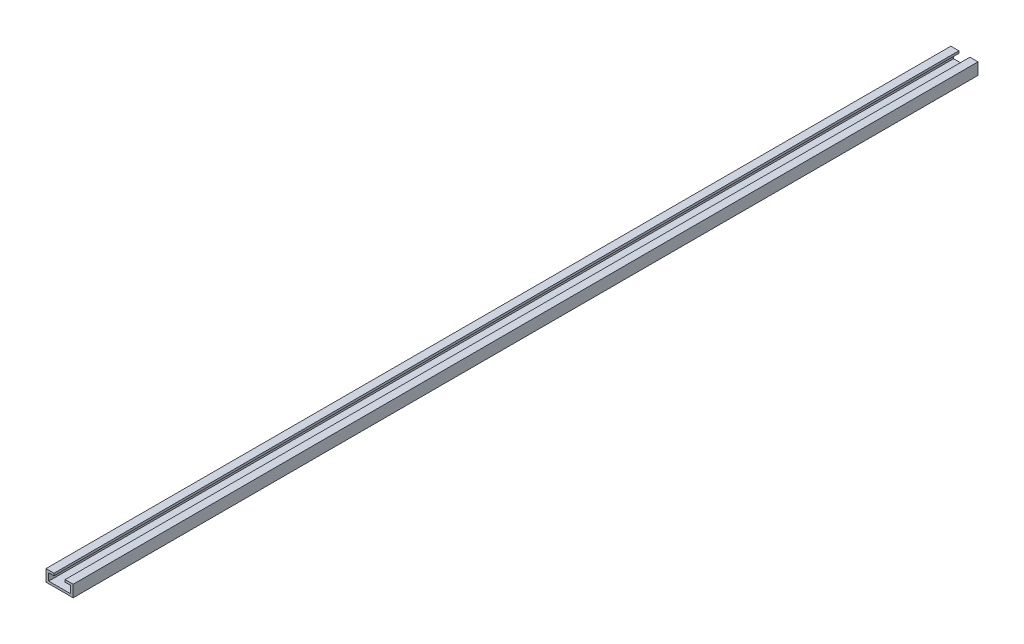
ISO-10303-21;
HEADER;
FILE_DESCRIPTION(('STEP AP214'),'2;1');
FILE_NAME('part.step','',(''),(''),'','','');
FILE_SCHEMA(('AUTOMOTIVE_DESIGN { 1 0 10303 214 1 1 1 1 }'));
ENDSEC;
DATA;
#1=APPLICATION_CONTEXT('core data for automotive mechanical design processes');
#2=APPLICATION_PROTOCOL_DEFINITION('international standard','automotive_design',2000,#1);
#3=PRODUCT_CONTEXT('',#1,'mechanical');
#4=PRODUCT('Part','Part','',(#3));
#5=PRODUCT_RELATED_PRODUCT_CATEGORY('part','',(#4));
#6=PRODUCT_DEFINITION_FORMATION('','',#4);
#7=PRODUCT_DEFINITION_CONTEXT('part definition',#1,'design');
#8=PRODUCT_DEFINITION('design','',#6,#7);
#9=PRODUCT_DEFINITION_SHAPE('','',#8);
#10=(LENGTH_UNIT() NAMED_UNIT(*) SI_UNIT(.MILLI.,.METRE.));
#11=(NAMED_UNIT(*) PLANE_ANGLE_UNIT() SI_UNIT($,.RADIAN.));
#12=(NAMED_UNIT(*) SI_UNIT($,.STERADIAN.) SOLID_ANGLE_UNIT());
#13=UNCERTAINTY_MEASURE_WITH_UNIT(LENGTH_MEASURE(1.E-05),#10,'distance_accuracy_value','');
#14=(GEOMETRIC_REPRESENTATION_CONTEXT(3) GLOBAL_UNCERTAINTY_ASSIGNED_CONTEXT((#13)) GLOBAL_UNIT_ASSIGNED_CONTEXT((#10,
#11,#12)) REPRESENTATION_CONTEXT('',''));
#15=CARTESIAN_POINT('',(0.,0.,0.));
#16=DIRECTION('',(0.,0.,1.));
#17=DIRECTION('',(1.,0.,0.));
#18=AXIS2_PLACEMENT_3D('',#15,#16,#17);
#19=CARTESIAN_POINT('',(15.,13.0282977305688,1000.));
#20=DIRECTION('',(-1.,0.,0.));
#21=DIRECTION('',(0.,0.,1.));
#22=AXIS2_PLACEMENT_3D('',#19,#20,#21);
#23=PLANE('',#22);
#24=DIRECTION('',(0.,1.,0.));
#25=VECTOR('',#24,1.);
#26=CARTESIAN_POINT('',(15.,13.0282977305688,0.));
#27=LINE('',#26,#25);
#28=CARTESIAN_POINT('',(15.,0.,0.));
#29=VERTEX_POINT('',#28);
#30=CARTESIAN_POINT('',(15.,13.0282977305688,0.));
#31=VERTEX_POINT('',#30);
#32=EDGE_CURVE('E154',#29,#31,#27,.T.);
#33=ORIENTED_EDGE('',*,*,#32,.T.);
#34=DIRECTION('',(0.,0.,-1.));
#35=VECTOR('',#34,1.);
#36=CARTESIAN_POINT('',(15.,13.0282977305688,1000.));
#37=LINE('',#36,#35);
#38=CARTESIAN_POINT('',(15.,13.0282977305688,1000.));
#39=VERTEX_POINT('',#38);
#40=EDGE_CURVE('E11',#39,#31,#37,.T.);
#41=ORIENTED_EDGE('',*,*,#40,.F.);
#42=DIRECTION('',(0.,1.,0.));
#43=VECTOR('',#42,1.);
#44=CARTESIAN_POINT('',(15.,13.0282977305688,1000.));
#45=LINE('',#44,#43);
#46=CARTESIAN_POINT('',(15.,0.,1000.));
#47=VERTEX_POINT('',#46);
#48=EDGE_CURVE('E177',#47,#39,#45,.T.);
#49=ORIENTED_EDGE('',*,*,#48,.F.);
#50=DIRECTION('',(0.,0.,-1.));
#51=VECTOR('',#50,1.);
#52=CARTESIAN_POINT('',(15.,0.,1000.));
#53=LINE('',#52,#51);
#54=EDGE_CURVE('E150',#47,#29,#53,.T.);
#55=ORIENTED_EDGE('',*,*,#54,.T.);
#56=EDGE_LOOP('',(#33,#41,#49,#55));
#57=FACE_BOUND('',#56,.T.);
#58=ADVANCED_FACE('F35',(#57),#23,.F.);
#59=CARTESIAN_POINT('',(6.1,13.0282977305688,1000.));
#60=DIRECTION('',(0.,-1.,0.));
#61=DIRECTION('',(0.,0.,-1.));
#62=AXIS2_PLACEMENT_3D('',#59,#60,#61);
#63=PLANE('',#62);
#64=DIRECTION('',(-1.,0.,0.));
#65=VECTOR('',#64,1.);
#66=CARTESIAN_POINT('',(6.1,13.0282977305688,0.));
#67=LINE('',#66,#65);
#68=CARTESIAN_POINT('',(6.1,13.0282977305688,0.));
#69=VERTEX_POINT('',#68);
#70=EDGE_CURVE('E157',#31,#69,#67,.T.);
#71=ORIENTED_EDGE('',*,*,#70,.T.);
#72=DIRECTION('',(0.,0.,-1.));
#73=VECTOR('',#72,1.);
#74=CARTESIAN_POINT('',(6.1,13.0282977305688,1000.));
#75=LINE('',#74,#73);
#76=CARTESIAN_POINT('',(6.1,13.0282977305688,1000.));
#77=VERTEX_POINT('',#76);
#78=EDGE_CURVE('E43',#77,#69,#75,.T.);
#79=ORIENTED_EDGE('',*,*,#78,.F.);
#80=DIRECTION('',(-1.,0.,0.));
#81=VECTOR('',#80,1.);
#82=CARTESIAN_POINT('',(12.,13.0282977305688,1000.));
#83=LINE('',#82,#81);
#84=EDGE_CURVE('E106',#39,#77,#83,.T.);
#85=ORIENTED_EDGE('',*,*,#84,.F.);
#86=ORIENTED_EDGE('',*,*,#40,.T.);
#87=EDGE_LOOP('',(#71,#79,#85,#86));
#88=FACE_BOUND('',#87,.T.);
#89=ADVANCED_FACE('F256',(#88),#63,.F.);
#90=CARTESIAN_POINT('',(6.1,10.5282977305688,1000.));
#91=DIRECTION('',(1.,0.,0.));
#92=DIRECTION('',(0.,0.,-1.));
#93=AXIS2_PLACEMENT_3D('',#90,#91,#92);
#94=PLANE('',#93);
#95=DIRECTION('',(0.,-1.,0.));
#96=VECTOR('',#95,1.);
#97=CARTESIAN_POINT('',(6.1,10.5282977305688,0.));
#98=LINE('',#97,#96);
#99=CARTESIAN_POINT('',(6.1,10.5282977305688,0.));
#100=VERTEX_POINT('',#99);
#101=EDGE_CURVE('E159',#69,#100,#98,.T.);
#102=ORIENTED_EDGE('',*,*,#101,.T.);
#103=DIRECTION('',(0.,0.,-1.));
#104=VECTOR('',#103,1.);
#105=CARTESIAN_POINT('',(6.1,10.5282977305688,1000.));
#106=LINE('',#105,#104);
#107=CARTESIAN_POINT('',(6.1,10.5282977305688,1000.));
#108=VERTEX_POINT('',#107);
#109=EDGE_CURVE('E196',#108,#100,#106,.T.);
#110=ORIENTED_EDGE('',*,*,#109,.F.);
#111=DIRECTION('',(0.,-1.,0.));
#112=VECTOR('',#111,1.);
#113=CARTESIAN_POINT('',(6.1,10.5282977305688,1000.));
#114=LINE('',#113,#112);
#115=EDGE_CURVE('E204',#77,#108,#114,.T.);
#116=ORIENTED_EDGE('',*,*,#115,.F.);
#117=ORIENTED_EDGE('',*,*,#78,.T.);
#118=EDGE_LOOP('',(#102,#110,#116,#117));
#119=FACE_BOUND('',#118,.T.);
#120=ADVANCED_FACE('F202',(#119),#94,.F.);
#121=CARTESIAN_POINT('',(12.,10.5282977305688,1000.));
#122=DIRECTION('',(0.,1.,0.));
#123=DIRECTION('',(0.,0.,1.));
#124=AXIS2_PLACEMENT_3D('',#121,#122,#123);
#125=PLANE('',#124);
#126=DIRECTION('',(1.,0.,0.));
#127=VECTOR('',#126,1.);
#128=CARTESIAN_POINT('',(12.,10.5282977305688,0.));
#129=LINE('',#128,#127);
#130=CARTESIAN_POINT('',(12.,10.5282977305688,0.));
#131=VERTEX_POINT('',#130);
#132=EDGE_CURVE('E161',#100,#131,#129,.T.);
#133=ORIENTED_EDGE('',*,*,#132,.T.);
#134=DIRECTION('',(0.,0.,-1.));
#135=VECTOR('',#134,1.);
#136=CARTESIAN_POINT('',(12.,10.5282977305688,1000.));
#137=LINE('',#136,#135);
#138=CARTESIAN_POINT('',(12.,10.5282977305688,1000.));
#139=VERTEX_POINT('',#138);
#140=EDGE_CURVE('E193',#139,#131,#137,.T.);
#141=ORIENTED_EDGE('',*,*,#140,.F.);
#142=DIRECTION('',(1.,0.,0.));
#143=VECTOR('',#142,1.);
#144=CARTESIAN_POINT('',(12.,10.5282977305688,1000.));
#145=LINE('',#144,#143);
#146=EDGE_CURVE('E222',#108,#139,#145,.T.);
#147=ORIENTED_EDGE('',*,*,#146,.F.);
#148=ORIENTED_EDGE('',*,*,#109,.T.);
#149=EDGE_LOOP('',(#133,#141,#147,#148));
#150=FACE_BOUND('',#149,.T.);
#151=ADVANCED_FACE('F213',(#150),#125,.F.);
#152=CARTESIAN_POINT('',(12.,2.5,1000.));
#153=DIRECTION('',(1.,0.,0.));
#154=DIRECTION('',(0.,0.,-1.));
#155=AXIS2_PLACEMENT_3D('',#152,#153,#154);
#156=PLANE('',#155);
#157=DIRECTION('',(0.,-1.,0.));
#158=VECTOR('',#157,1.);
#159=CARTESIAN_POINT('',(12.,2.5,0.));
#160=LINE('',#159,#158);
#161=CARTESIAN_POINT('',(12.,2.5,0.));
#162=VERTEX_POINT('',#161);
#163=EDGE_CURVE('E163',#131,#162,#160,.T.);
#164=ORIENTED_EDGE('',*,*,#163,.T.);
#165=DIRECTION('',(0.,0.,-1.));
#166=VECTOR('',#165,1.);
#167=CARTESIAN_POINT('',(12.,2.5,1000.));
#168=LINE('',#167,#166);
#169=CARTESIAN_POINT('',(12.,2.5,1000.));
#170=VERTEX_POINT('',#169);
#171=EDGE_CURVE('E190',#170,#162,#168,.T.);
#172=ORIENTED_EDGE('',*,*,#171,.F.);
#173=DIRECTION('',(0.,-1.,0.));
#174=VECTOR('',#173,1.);
#175=CARTESIAN_POINT('',(12.,2.5,1000.));
#176=LINE('',#175,#174);
#177=EDGE_CURVE('E219',#139,#170,#176,.T.);
#178=ORIENTED_EDGE('',*,*,#177,.F.);
#179=ORIENTED_EDGE('',*,*,#140,.T.);
#180=EDGE_LOOP('',(#164,#172,#178,#179));
#181=FACE_BOUND('',#180,.T.);
#182=ADVANCED_FACE('F217',(#181),#156,.F.);
#183=CARTESIAN_POINT('',(-12.,2.50000000000001,1000.));
#184=DIRECTION('',(0.,-1.,0.));
#185=DIRECTION('',(1.,0.,0.));
#186=AXIS2_PLACEMENT_3D('',#183,#184,#185);
#187=PLANE('',#186);
#188=DIRECTION('',(-1.,0.,0.));
#189=VECTOR('',#188,1.);
#190=CARTESIAN_POINT('',(-12.,2.50000000000001,0.));
#191=LINE('',#190,#189);
#192=CARTESIAN_POINT('',(-12.,2.50000000000001,0.));
#193=VERTEX_POINT('',#192);
#194=EDGE_CURVE('E165',#162,#193,#191,.T.);
#195=ORIENTED_EDGE('',*,*,#194,.T.);
#196=DIRECTION('',(0.,0.,-1.));
#197=VECTOR('',#196,1.);
#198=CARTESIAN_POINT('',(-12.,2.50000000000001,1000.));
#199=LINE('',#198,#197);
#200=CARTESIAN_POINT('',(-12.,2.50000000000001,1000.));
#201=VERTEX_POINT('',#200);
#202=EDGE_CURVE('E187',#201,#193,#199,.T.);
#203=ORIENTED_EDGE('',*,*,#202,.F.);
#204=DIRECTION('',(-1.,0.,0.));
#205=VECTOR('',#204,1.);
#206=CARTESIAN_POINT('',(-12.,2.50000000000001,1000.));
#207=LINE('',#206,#205);
#208=EDGE_CURVE('E221',#170,#201,#207,.T.);
#209=ORIENTED_EDGE('',*,*,#208,.F.);
#210=ORIENTED_EDGE('',*,*,#171,.T.);
#211=EDGE_LOOP('',(#195,#203,#209,#210));
#212=FACE_BOUND('',#211,.T.);
#213=ADVANCED_FACE('F269',(#212),#187,.F.);
#214=CARTESIAN_POINT('',(-12.,2.50000000000001,1000.));
#215=DIRECTION('',(-1.,0.,0.));
#216=DIRECTION('',(0.,-1.,0.));
#217=AXIS2_PLACEMENT_3D('',#214,#215,#216);
#218=PLANE('',#217);
#219=DIRECTION('',(0.,1.,0.));
#220=VECTOR('',#219,1.);
#221=CARTESIAN_POINT('',(-12.,2.50000000000001,0.));
#222=LINE('',#221,#220);
#223=CARTESIAN_POINT('',(-12.,10.5282977305688,0.));
#224=VERTEX_POINT('',#223);
#225=EDGE_CURVE('E167',#193,#224,#222,.T.);
#226=ORIENTED_EDGE('',*,*,#225,.T.);
#227=DIRECTION('',(0.,0.,-1.));
#228=VECTOR('',#227,1.);
#229=CARTESIAN_POINT('',(-12.,10.5282977305688,1000.));
#230=LINE('',#229,#228);
#231=CARTESIAN_POINT('',(-12.,10.5282977305688,1000.));
#232=VERTEX_POINT('',#231);
#233=EDGE_CURVE('E184',#232,#224,#230,.T.);
#234=ORIENTED_EDGE('',*,*,#233,.F.);
#235=DIRECTION('',(0.,1.,0.));
#236=VECTOR('',#235,1.);
#237=CARTESIAN_POINT('',(-12.,2.50000000000001,1000.));
#238=LINE('',#237,#236);
#239=EDGE_CURVE('E224',#201,#232,#238,.T.);
#240=ORIENTED_EDGE('',*,*,#239,.F.);
#241=ORIENTED_EDGE('',*,*,#202,.T.);
#242=EDGE_LOOP('',(#226,#234,#240,#241));
#243=FACE_BOUND('',#242,.T.);
#244=ADVANCED_FACE('F272',(#243),#218,.F.);
#245=CARTESIAN_POINT('',(-12.,10.5282977305688,1000.));
#246=DIRECTION('',(0.,1.,0.));
#247=DIRECTION('',(-1.,0.,0.));
#248=AXIS2_PLACEMENT_3D('',#245,#246,#247);
#249=PLANE('',#248);
#250=DIRECTION('',(1.,0.,0.));
#251=VECTOR('',#250,1.);
#252=CARTESIAN_POINT('',(-12.,10.5282977305688,0.));
#253=LINE('',#252,#251);
#254=CARTESIAN_POINT('',(-6.09999999999999,10.5282977305688,0.));
#255=VERTEX_POINT('',#254);
#256=EDGE_CURVE('E169',#224,#255,#253,.T.);
#257=ORIENTED_EDGE('',*,*,#256,.T.);
#258=DIRECTION('',(0.,0.,-1.));
#259=VECTOR('',#258,1.);
#260=CARTESIAN_POINT('',(-6.09999999999999,10.5282977305688,1000.));
#261=LINE('',#260,#259);
#262=CARTESIAN_POINT('',(-6.09999999999999,10.5282977305688,1000.));
#263=VERTEX_POINT('',#262);
#264=EDGE_CURVE('E181',#263,#255,#261,.T.);
#265=ORIENTED_EDGE('',*,*,#264,.F.);
#266=DIRECTION('',(1.,0.,0.));
#267=VECTOR('',#266,1.);
#268=CARTESIAN_POINT('',(-12.,10.5282977305688,1000.));
#269=LINE('',#268,#267);
#270=EDGE_CURVE('E230',#232,#263,#269,.T.);
#271=ORIENTED_EDGE('',*,*,#270,.F.);
#272=ORIENTED_EDGE('',*,*,#233,.T.);
#273=EDGE_LOOP('',(#257,#265,#271,#272));
#274=FACE_BOUND('',#273,.T.);
#275=ADVANCED_FACE('F236',(#274),#249,.F.);
#276=CARTESIAN_POINT('',(-6.09999999999999,10.5282977305688,1000.));
#277=DIRECTION('',(-1.,0.,0.));
#278=DIRECTION('',(0.,-1.,0.));
#279=AXIS2_PLACEMENT_3D('',#276,#277,#278);
#280=PLANE('',#279);
#281=DIRECTION('',(0.,1.,0.));
#282=VECTOR('',#281,1.);
#283=CARTESIAN_POINT('',(-6.09999999999999,10.5282977305688,0.));
#284=LINE('',#283,#282);
#285=CARTESIAN_POINT('',(-6.09999999999999,13.0282977305688,0.));
#286=VERTEX_POINT('',#285);
#287=EDGE_CURVE('E171',#255,#286,#284,.T.);
#288=ORIENTED_EDGE('',*,*,#287,.T.);
#289=DIRECTION('',(0.,0.,-1.));
#290=VECTOR('',#289,1.);
#291=CARTESIAN_POINT('',(-6.09999999999999,13.0282977305688,1000.));
#292=LINE('',#291,#290);
#293=CARTESIAN_POINT('',(-6.09999999999999,13.0282977305688,1000.));
#294=VERTEX_POINT('',#293);
#295=EDGE_CURVE('E145',#294,#286,#292,.T.);
#296=ORIENTED_EDGE('',*,*,#295,.F.);
#297=DIRECTION('',(0.,1.,0.));
#298=VECTOR('',#297,1.);
#299=CARTESIAN_POINT('',(-6.09999999999999,10.5282977305688,1000.));
#300=LINE('',#299,#298);
#301=EDGE_CURVE('E137',#263,#294,#300,.T.);
#302=ORIENTED_EDGE('',*,*,#301,.F.);
#303=ORIENTED_EDGE('',*,*,#264,.T.);
#304=EDGE_LOOP('',(#288,#296,#302,#303));
#305=FACE_BOUND('',#304,.T.);
#306=ADVANCED_FACE('F240',(#305),#280,.F.);
#307=CARTESIAN_POINT('',(-12.,13.0282977305688,1000.));
#308=DIRECTION('',(0.,-1.,0.));
#309=DIRECTION('',(1.,0.,0.));
#310=AXIS2_PLACEMENT_3D('',#307,#308,#309);
#311=PLANE('',#310);
#312=DIRECTION('',(-1.,0.,0.));
#313=VECTOR('',#312,1.);
#314=CARTESIAN_POINT('',(-12.,13.0282977305688,0.));
#315=LINE('',#314,#313);
#316=CARTESIAN_POINT('',(-15.,13.0282977305688,0.));
#317=VERTEX_POINT('',#316);
#318=EDGE_CURVE('E144',#286,#317,#315,.T.);
#319=ORIENTED_EDGE('',*,*,#318,.T.);
#320=DIRECTION('',(0.,0.,-1.));
#321=VECTOR('',#320,1.);
#322=CARTESIAN_POINT('',(-15.,13.0282977305688,1000.));
#323=LINE('',#322,#321);
#324=CARTESIAN_POINT('',(-15.,13.0282977305688,1000.));
#325=VERTEX_POINT('',#324);
#326=EDGE_CURVE('E142',#325,#317,#323,.T.);
#327=ORIENTED_EDGE('',*,*,#326,.F.);
#328=DIRECTION('',(-1.,0.,0.));
#329=VECTOR('',#328,1.);
#330=CARTESIAN_POINT('',(-6.09999999999999,13.0282977305688,1000.));
#331=LINE('',#330,#329);
#332=EDGE_CURVE('E131',#294,#325,#331,.T.);
#333=ORIENTED_EDGE('',*,*,#332,.F.);
#334=ORIENTED_EDGE('',*,*,#295,.T.);
#335=EDGE_LOOP('',(#319,#327,#333,#334));
#336=FACE_BOUND('',#335,.T.);
#337=ADVANCED_FACE('F143',(#336),#311,.F.);
#338=CARTESIAN_POINT('',(-15.,13.0282977305688,1000.));
#339=DIRECTION('',(1.,0.,0.));
#340=DIRECTION('',(0.,1.,0.));
#341=AXIS2_PLACEMENT_3D('',#338,#339,#340);
#342=PLANE('',#341);
#343=DIRECTION('',(0.,-1.,0.));
#344=VECTOR('',#343,1.);
#345=CARTESIAN_POINT('',(-15.,13.0282977305688,0.));
#346=LINE('',#345,#344);
#347=CARTESIAN_POINT('',(-15.,0.,0.));
#348=VERTEX_POINT('',#347);
#349=EDGE_CURVE('E92',#317,#348,#346,.T.);
#350=ORIENTED_EDGE('',*,*,#349,.T.);
#351=DIRECTION('',(0.,0.,-1.));
#352=VECTOR('',#351,1.);
#353=CARTESIAN_POINT('',(-15.,0.,1000.));
#354=LINE('',#353,#352);
#355=CARTESIAN_POINT('',(-15.,0.,1000.));
#356=VERTEX_POINT('',#355);
#357=EDGE_CURVE('E146',#356,#348,#354,.T.);
#358=ORIENTED_EDGE('',*,*,#357,.F.);
#359=DIRECTION('',(0.,-1.,0.));
#360=VECTOR('',#359,1.);
#361=CARTESIAN_POINT('',(-15.,13.0282977305688,1000.));
#362=LINE('',#361,#360);
#363=EDGE_CURVE('E135',#325,#356,#362,.T.);
#364=ORIENTED_EDGE('',*,*,#363,.F.);
#365=ORIENTED_EDGE('',*,*,#326,.T.);
#366=EDGE_LOOP('',(#350,#358,#364,#365));
#367=FACE_BOUND('',#366,.T.);
#368=ADVANCED_FACE('F148',(#367),#342,.F.);
#369=CARTESIAN_POINT('',(-15.,0.,1000.));
#370=DIRECTION('',(0.,1.,0.));
#371=DIRECTION('',(-1.,0.,0.));
#372=AXIS2_PLACEMENT_3D('',#369,#370,#371);
#373=PLANE('',#372);
#374=DIRECTION('',(1.,0.,0.));
#375=VECTOR('',#374,1.);
#376=CARTESIAN_POINT('',(-15.,0.,0.));
#377=LINE('',#376,#375);
#378=EDGE_CURVE('E98',#348,#29,#377,.T.);
#379=ORIENTED_EDGE('',*,*,#378,.T.);
#380=ORIENTED_EDGE('',*,*,#54,.F.);
#381=DIRECTION('',(1.,0.,0.));
#382=VECTOR('',#381,1.);
#383=CARTESIAN_POINT('',(-15.,0.,1000.));
#384=LINE('',#383,#382);
#385=EDGE_CURVE('E51',#356,#47,#384,.T.);
#386=ORIENTED_EDGE('',*,*,#385,.F.);
#387=ORIENTED_EDGE('',*,*,#357,.T.);
#388=EDGE_LOOP('',(#379,#380,#386,#387));
#389=FACE_BOUND('',#388,.T.);
#390=ADVANCED_FACE('F245',(#389),#373,.F.);
#391=CARTESIAN_POINT('',(0.,0.,1000.));
#392=DIRECTION('',(0.,0.,1.));
#393=DIRECTION('',(1.,0.,0.));
#394=AXIS2_PLACEMENT_3D('',#391,#392,#393);
#395=PLANE('',#394);
#396=ORIENTED_EDGE('',*,*,#48,.T.);
#397=ORIENTED_EDGE('',*,*,#84,.T.);
#398=ORIENTED_EDGE('',*,*,#115,.T.);
#399=ORIENTED_EDGE('',*,*,#146,.T.);
#400=ORIENTED_EDGE('',*,*,#177,.T.);
#401=ORIENTED_EDGE('',*,*,#208,.T.);
#402=ORIENTED_EDGE('',*,*,#239,.T.);
#403=ORIENTED_EDGE('',*,*,#270,.T.);
#404=ORIENTED_EDGE('',*,*,#301,.T.);
#405=ORIENTED_EDGE('',*,*,#332,.T.);
#406=ORIENTED_EDGE('',*,*,#363,.T.);
#407=ORIENTED_EDGE('',*,*,#385,.T.);
#408=EDGE_LOOP('',(#396,#397,#398,#399,#400,#401,#402,#403,#404,#405,#406,#407));
#409=FACE_BOUND('',#408,.T.);
#410=ADVANCED_FACE('F133',(#409),#395,.T.);
#411=CARTESIAN_POINT('',(0.,0.,0.));
#412=DIRECTION('',(0.,0.,1.));
#413=DIRECTION('',(1.,0.,0.));
#414=AXIS2_PLACEMENT_3D('',#411,#412,#413);
#415=PLANE('',#414);
#416=ORIENTED_EDGE('',*,*,#32,.F.);
#417=ORIENTED_EDGE('',*,*,#378,.F.);
#418=ORIENTED_EDGE('',*,*,#349,.F.);
#419=ORIENTED_EDGE('',*,*,#318,.F.);
#420=ORIENTED_EDGE('',*,*,#287,.F.);
#421=ORIENTED_EDGE('',*,*,#256,.F.);
#422=ORIENTED_EDGE('',*,*,#225,.F.);
#423=ORIENTED_EDGE('',*,*,#194,.F.);
#424=ORIENTED_EDGE('',*,*,#163,.F.);
#425=ORIENTED_EDGE('',*,*,#132,.F.);
#426=ORIENTED_EDGE('',*,*,#101,.F.);
#427=ORIENTED_EDGE('',*,*,#70,.F.);
#428=EDGE_LOOP('',(#416,#417,#418,#419,#420,#421,#422,#423,#424,#425,#426,#427));
#429=FACE_BOUND('',#428,.T.);
#430=ADVANCED_FACE('F208',(#429),#415,.F.);
#431=CLOSED_SHELL('',(#58,#89,#120,#151,#182,#213,#244,#275,#306,#337,#368,#390,#410,#430));
#432=MANIFOLD_SOLID_BREP('B2',#431);
#433=ADVANCED_BREP_SHAPE_REPRESENTATION('',(#18,#432),#14);
#434=SHAPE_DEFINITION_REPRESENTATION(#9,#433);
ENDSEC;
END-ISO-10303-21;
